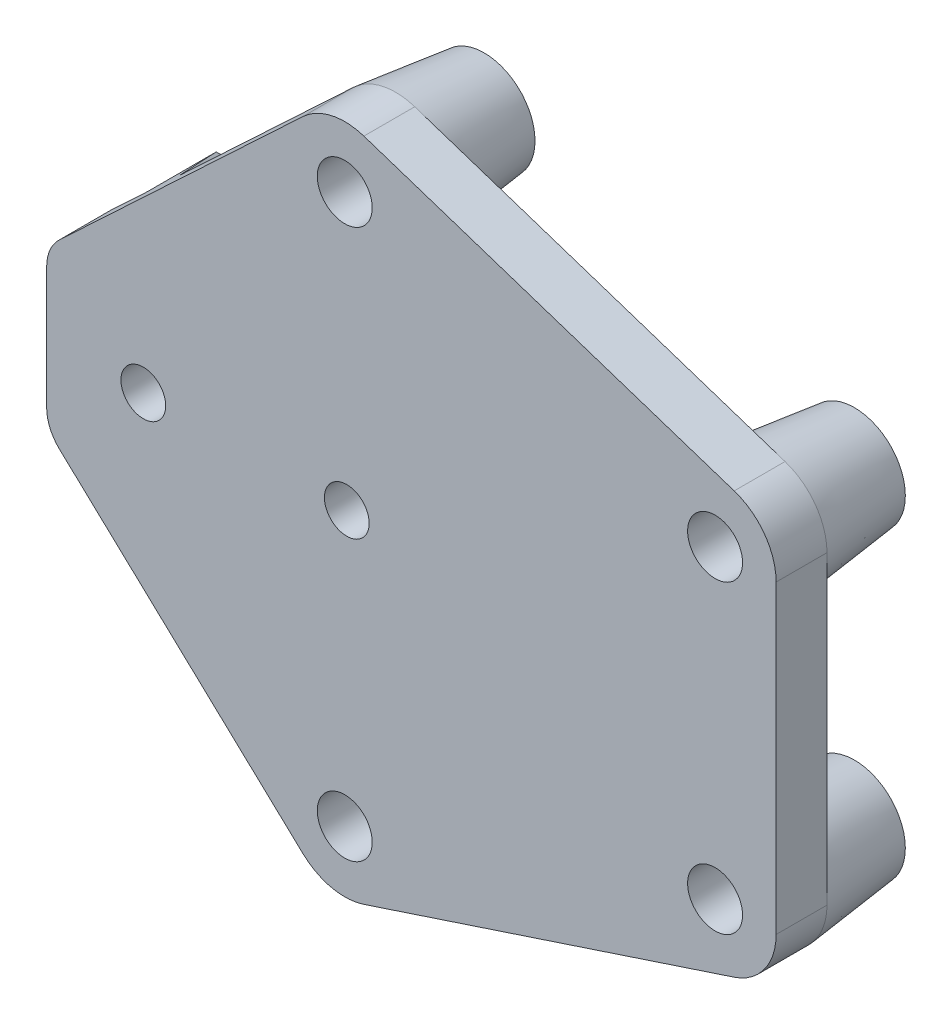
ISO-10303-21;
HEADER;
FILE_DESCRIPTION(('STEP AP214'),'2;1');
FILE_NAME('part.step','',(''),(''),'','','');
FILE_SCHEMA(('AUTOMOTIVE_DESIGN { 1 0 10303 214 1 1 1 1 }'));
ENDSEC;
DATA;
#1=APPLICATION_CONTEXT('core data for automotive mechanical design processes');
#2=APPLICATION_PROTOCOL_DEFINITION('international standard','automotive_design',2000,#1);
#3=PRODUCT_CONTEXT('',#1,'mechanical');
#4=PRODUCT('Part','Part','',(#3));
#5=PRODUCT_RELATED_PRODUCT_CATEGORY('part','',(#4));
#6=PRODUCT_DEFINITION_FORMATION('','',#4);
#7=PRODUCT_DEFINITION_CONTEXT('part definition',#1,'design');
#8=PRODUCT_DEFINITION('design','',#6,#7);
#9=PRODUCT_DEFINITION_SHAPE('','',#8);
#10=(LENGTH_UNIT() NAMED_UNIT(*) SI_UNIT(.MILLI.,.METRE.));
#11=(NAMED_UNIT(*) PLANE_ANGLE_UNIT() SI_UNIT($,.RADIAN.));
#12=(NAMED_UNIT(*) SI_UNIT($,.STERADIAN.) SOLID_ANGLE_UNIT());
#13=UNCERTAINTY_MEASURE_WITH_UNIT(LENGTH_MEASURE(1.E-05),#10,'distance_accuracy_value','');
#14=(GEOMETRIC_REPRESENTATION_CONTEXT(3) GLOBAL_UNCERTAINTY_ASSIGNED_CONTEXT((#13)) GLOBAL_UNIT_ASSIGNED_CONTEXT((#10,
#11,#12)) REPRESENTATION_CONTEXT('',''));
#15=CARTESIAN_POINT('',(0.,0.,0.));
#16=DIRECTION('',(0.,0.,1.));
#17=DIRECTION('',(1.,0.,0.));
#18=AXIS2_PLACEMENT_3D('',#15,#16,#17);
#19=CARTESIAN_POINT('',(0.,0.,0.));
#20=DIRECTION('',(0.,0.,1.));
#21=DIRECTION('',(1.,0.,0.));
#22=AXIS2_PLACEMENT_3D('',#19,#20,#21);
#23=PLANE('',#22);
#24=CARTESIAN_POINT('',(-38.,0.,0.));
#25=DIRECTION('',(0.,0.,1.));
#26=DIRECTION('',(1.,0.,0.));
#27=AXIS2_PLACEMENT_3D('',#24,#25,#26);
#28=CIRCLE('',#27,2.2);
#29=CARTESIAN_POINT('',(-35.8,0.,0.));
#30=VERTEX_POINT('',#29);
#31=EDGE_CURVE('E271',#30,#30,#28,.T.);
#32=ORIENTED_EDGE('',*,*,#31,.T.);
#33=EDGE_LOOP('',(#32));
#34=FACE_BOUND('',#33,.T.);
#35=CARTESIAN_POINT('',(-18.,0.,0.));
#36=DIRECTION('',(0.,0.,1.));
#37=DIRECTION('',(1.,0.,0.));
#38=AXIS2_PLACEMENT_3D('',#35,#36,#37);
#39=CIRCLE('',#38,2.2);
#40=CARTESIAN_POINT('',(-15.8,0.,0.));
#41=VERTEX_POINT('',#40);
#42=EDGE_CURVE('E345',#41,#41,#39,.T.);
#43=ORIENTED_EDGE('',*,*,#42,.T.);
#44=EDGE_LOOP('',(#43));
#45=FACE_BOUND('',#44,.T.);
#46=DIRECTION('',(-0.729191786496374,0.684309388000945,0.));
#47=VECTOR('',#46,1.);
#48=CARTESIAN_POINT('',(-26.1013454879406,-27.8132772690884,0.));
#49=LINE('',#48,#47);
#50=CARTESIAN_POINT('',(-22.3058563280057,-31.3751507189783,0.));
#51=VERTEX_POINT('',#50);
#52=CARTESIAN_POINT('',(-39.435342020454,-15.3,0.));
#53=VERTEX_POINT('',#52);
#54=EDGE_CURVE('E320',#51,#53,#49,.T.);
#55=ORIENTED_EDGE('',*,*,#54,.T.);
#56=DIRECTION('',(1.,0.,0.));
#57=VECTOR('',#56,1.);
#58=CARTESIAN_POINT('',(-13.,-15.3,0.));
#59=LINE('',#58,#57);
#60=CARTESIAN_POINT('',(-13.,-15.3,0.));
#61=VERTEX_POINT('',#60);
#62=EDGE_CURVE('E184',#53,#61,#59,.T.);
#63=ORIENTED_EDGE('',*,*,#62,.T.);
#64=DIRECTION('',(0.,1.,0.));
#65=VECTOR('',#64,1.);
#66=CARTESIAN_POINT('',(-13.,0.,0.));
#67=LINE('',#66,#65);
#68=CARTESIAN_POINT('',(-13.,-10.3,0.));
#69=VERTEX_POINT('',#68);
#70=EDGE_CURVE('E53',#61,#69,#67,.T.);
#71=ORIENTED_EDGE('',*,*,#70,.T.);
#72=DIRECTION('',(1.,0.,0.));
#73=VECTOR('',#72,1.);
#74=CARTESIAN_POINT('',(0.,-10.3,0.));
#75=LINE('',#74,#73);
#76=CARTESIAN_POINT('',(-42.6321056449889,-10.3,0.));
#77=VERTEX_POINT('',#76);
#78=EDGE_CURVE('E210',#77,#69,#75,.T.);
#79=ORIENTED_EDGE('',*,*,#78,.F.);
#80=DIRECTION('',(0.,1.,0.));
#81=VECTOR('',#80,1.);
#82=CARTESIAN_POINT('',(-42.6321056449889,-1.47909828985371E-13,0.));
#83=LINE('',#82,#81);
#84=CARTESIAN_POINT('',(-42.6321056449889,-12.3,0.));
#85=VERTEX_POINT('',#84);
#86=EDGE_CURVE('E213',#85,#77,#83,.T.);
#87=ORIENTED_EDGE('',*,*,#86,.F.);
#88=CARTESIAN_POINT('',(-46.2372375520038,-8.91676714598549,0.));
#89=VERTEX_POINT('',#88);
#90=EDGE_CURVE('E192',#85,#89,#49,.T.);
#91=ORIENTED_EDGE('',*,*,#90,.T.);
#92=CARTESIAN_POINT('',(-43.5,-6.,0.));
#93=DIRECTION('',(0.,0.,1.));
#94=DIRECTION('',(1.,0.,0.));
#95=AXIS2_PLACEMENT_3D('',#92,#93,#94);
#96=CIRCLE('',#95,4.);
#97=CARTESIAN_POINT('',(-47.5,-6.,0.));
#98=VERTEX_POINT('',#97);
#99=EDGE_CURVE('E267',#98,#89,#96,.T.);
#100=ORIENTED_EDGE('',*,*,#99,.F.);
#101=DIRECTION('',(0.,-1.,0.));
#102=VECTOR('',#101,1.);
#103=CARTESIAN_POINT('',(-47.5,0.,0.));
#104=LINE('',#103,#102);
#105=CARTESIAN_POINT('',(-47.5,6.,0.));
#106=VERTEX_POINT('',#105);
#107=EDGE_CURVE('E343',#106,#98,#104,.T.);
#108=ORIENTED_EDGE('',*,*,#107,.F.);
#109=CARTESIAN_POINT('',(-43.5,6.,0.));
#110=DIRECTION('',(0.,0.,1.));
#111=DIRECTION('',(1.,0.,0.));
#112=AXIS2_PLACEMENT_3D('',#109,#110,#111);
#113=CIRCLE('',#112,4.);
#114=CARTESIAN_POINT('',(-46.2372375520038,8.91676714598549,0.));
#115=VERTEX_POINT('',#114);
#116=EDGE_CURVE('E340',#106,#115,#113,.F.);
#117=ORIENTED_EDGE('',*,*,#116,.T.);
#118=DIRECTION('',(-0.729191786496373,-0.684309388000945,0.));
#119=VECTOR('',#118,1.);
#120=CARTESIAN_POINT('',(-26.1013454879406,27.8132772690883,0.));
#121=LINE('',#120,#119);
#122=CARTESIAN_POINT('',(-42.6321056449889,12.3,0.));
#123=VERTEX_POINT('',#122);
#124=EDGE_CURVE('E335',#123,#115,#121,.T.);
#125=ORIENTED_EDGE('',*,*,#124,.F.);
#126=DIRECTION('',(0.,-1.,0.));
#127=VECTOR('',#126,1.);
#128=CARTESIAN_POINT('',(-42.6321056449888,-1.47909828985371E-13,0.));
#129=LINE('',#128,#127);
#130=CARTESIAN_POINT('',(-42.6321056449888,10.3,0.));
#131=VERTEX_POINT('',#130);
#132=EDGE_CURVE('E218',#123,#131,#129,.T.);
#133=ORIENTED_EDGE('',*,*,#132,.T.);
#134=DIRECTION('',(1.,0.,0.));
#135=VECTOR('',#134,1.);
#136=CARTESIAN_POINT('',(0.,10.3,0.));
#137=LINE('',#136,#135);
#138=CARTESIAN_POINT('',(-13.,10.3,0.));
#139=VERTEX_POINT('',#138);
#140=EDGE_CURVE('E235',#131,#139,#137,.T.);
#141=ORIENTED_EDGE('',*,*,#140,.T.);
#142=DIRECTION('',(0.,-1.,0.));
#143=VECTOR('',#142,1.);
#144=CARTESIAN_POINT('',(-13.,0.,0.));
#145=LINE('',#144,#143);
#146=CARTESIAN_POINT('',(-13.,15.3,0.));
#147=VERTEX_POINT('',#146);
#148=EDGE_CURVE('E224',#147,#139,#145,.T.);
#149=ORIENTED_EDGE('',*,*,#148,.F.);
#150=DIRECTION('',(-1.,0.,0.));
#151=VECTOR('',#150,1.);
#152=CARTESIAN_POINT('',(-42.6321056449889,15.3,0.));
#153=LINE('',#152,#151);
#154=CARTESIAN_POINT('',(-39.435342020454,15.3,0.));
#155=VERTEX_POINT('',#154);
#156=EDGE_CURVE('E413',#147,#155,#153,.T.);
#157=ORIENTED_EDGE('',*,*,#156,.T.);
#158=CARTESIAN_POINT('',(-22.3058563280057,31.3751507189783,0.));
#159=VERTEX_POINT('',#158);
#160=EDGE_CURVE('E337',#159,#155,#121,.T.);
#161=ORIENTED_EDGE('',*,*,#160,.F.);
#162=CARTESIAN_POINT('',(-18.2,27.,0.));
#163=DIRECTION('',(0.,0.,1.));
#164=DIRECTION('',(1.,0.,0.));
#165=AXIS2_PLACEMENT_3D('',#162,#163,#164);
#166=CIRCLE('',#165,6.);
#167=CARTESIAN_POINT('',(-16.321429442616,32.6983306907314,0.));
#168=VERTEX_POINT('',#167);
#169=EDGE_CURVE('E383',#159,#168,#166,.T.);
#170=ORIENTED_EDGE('',*,*,#169,.T.);
#171=DIRECTION('',(0.949721781788549,-0.313095092897324,0.));
#172=VECTOR('',#171,1.);
#173=CARTESIAN_POINT('',(8.12298837679362,24.6397314096073,0.));
#174=LINE('',#173,#172);
#175=CARTESIAN_POINT('',(20.0785705573839,20.6983306907313,0.));
#176=VERTEX_POINT('',#175);
#177=EDGE_CURVE('E336',#168,#176,#174,.T.);
#178=ORIENTED_EDGE('',*,*,#177,.T.);
#179=CARTESIAN_POINT('',(18.2,15.,0.));
#180=DIRECTION('',(0.,0.,1.));
#181=DIRECTION('',(1.,0.,0.));
#182=AXIS2_PLACEMENT_3D('',#179,#180,#181);
#183=CIRCLE('',#182,6.);
#184=CARTESIAN_POINT('',(24.2000000000001,15.,0.));
#185=VERTEX_POINT('',#184);
#186=EDGE_CURVE('E378',#176,#185,#183,.T.);
#187=ORIENTED_EDGE('',*,*,#186,.T.);
#188=DIRECTION('',(0.,-1.,0.));
#189=VECTOR('',#188,1.);
#190=CARTESIAN_POINT('',(24.2000000000001,0.,0.));
#191=LINE('',#190,#189);
#192=CARTESIAN_POINT('',(24.2000000000001,-15.,0.));
#193=VERTEX_POINT('',#192);
#194=EDGE_CURVE('E331',#185,#193,#191,.T.);
#195=ORIENTED_EDGE('',*,*,#194,.T.);
#196=CARTESIAN_POINT('',(18.2,-15.,0.));
#197=DIRECTION('',(0.,0.,1.));
#198=DIRECTION('',(1.,0.,0.));
#199=AXIS2_PLACEMENT_3D('',#196,#197,#198);
#200=CIRCLE('',#199,6.);
#201=CARTESIAN_POINT('',(20.0785705573839,-20.6983306907313,0.));
#202=VERTEX_POINT('',#201);
#203=EDGE_CURVE('E407',#193,#202,#200,.T.);
#204=ORIENTED_EDGE('',*,*,#203,.T.);
#205=DIRECTION('',(-0.949721781788549,-0.313095092897324,0.));
#206=VECTOR('',#205,1.);
#207=CARTESIAN_POINT('',(8.12298837679361,-24.6397314096073,0.));
#208=LINE('',#207,#206);
#209=CARTESIAN_POINT('',(-16.3214294426161,-32.6983306907313,0.));
#210=VERTEX_POINT('',#209);
#211=EDGE_CURVE('E325',#202,#210,#208,.T.);
#212=ORIENTED_EDGE('',*,*,#211,.T.);
#213=CARTESIAN_POINT('',(-18.2,-27.,0.));
#214=DIRECTION('',(0.,0.,1.));
#215=DIRECTION('',(1.,0.,0.));
#216=AXIS2_PLACEMENT_3D('',#213,#214,#215);
#217=CIRCLE('',#216,6.);
#218=EDGE_CURVE('E410',#210,#51,#217,.T.);
#219=ORIENTED_EDGE('',*,*,#218,.T.);
#220=EDGE_LOOP('',(#55,#63,#71,#79,#87,#91,#100,#108,#117,#125,#133,#141,#149,#157,#161,#170,
#178,#187,#195,#204,#212,#219));
#221=FACE_BOUND('',#220,.T.);
#222=ADVANCED_FACE('F37',(#34,#45,#221),#23,.F.);
#223=CARTESIAN_POINT('',(-43.5,-6.,5.));
#224=DIRECTION('',(0.,0.,-1.));
#225=DIRECTION('',(-1.,0.,0.));
#226=AXIS2_PLACEMENT_3D('',#223,#224,#225);
#227=CYLINDRICAL_SURFACE('',#226,4.);
#228=ORIENTED_EDGE('',*,*,#99,.T.);
#229=DIRECTION('',(0.,0.,-1.));
#230=VECTOR('',#229,1.);
#231=CARTESIAN_POINT('',(-46.2372375520038,-8.91676714598549,5.));
#232=LINE('',#231,#230);
#233=CARTESIAN_POINT('',(-46.2372375520038,-8.91676714598549,5.));
#234=VERTEX_POINT('',#233);
#235=EDGE_CURVE('E376',#234,#89,#232,.T.);
#236=ORIENTED_EDGE('',*,*,#235,.F.);
#237=CARTESIAN_POINT('',(-43.5,-6.,5.));
#238=DIRECTION('',(0.,0.,1.));
#239=DIRECTION('',(1.,0.,0.));
#240=AXIS2_PLACEMENT_3D('',#237,#238,#239);
#241=CIRCLE('',#240,4.);
#242=CARTESIAN_POINT('',(-47.5,-6.,5.));
#243=VERTEX_POINT('',#242);
#244=EDGE_CURVE('E268',#243,#234,#241,.T.);
#245=ORIENTED_EDGE('',*,*,#244,.F.);
#246=DIRECTION('',(0.,0.,-1.));
#247=VECTOR('',#246,1.);
#248=CARTESIAN_POINT('',(-47.5,-6.,5.));
#249=LINE('',#248,#247);
#250=EDGE_CURVE('E317',#243,#98,#249,.T.);
#251=ORIENTED_EDGE('',*,*,#250,.T.);
#252=EDGE_LOOP('',(#228,#236,#245,#251));
#253=FACE_BOUND('',#252,.T.);
#254=ADVANCED_FACE('F444',(#253),#227,.T.);
#255=CARTESIAN_POINT('',(-26.1013454879406,-27.8132772690884,5.));
#256=DIRECTION('',(-0.684309388000945,-0.729191786496373,0.));
#257=DIRECTION('',(0.729191786496373,-0.684309388000945,0.));
#258=AXIS2_PLACEMENT_3D('',#255,#256,#257);
#259=PLANE('',#258);
#260=ORIENTED_EDGE('',*,*,#54,.F.);
#261=DIRECTION('',(0.,0.,-1.));
#262=VECTOR('',#261,1.);
#263=CARTESIAN_POINT('',(-22.3058563280057,-31.3751507189783,5.));
#264=LINE('',#263,#262);
#265=CARTESIAN_POINT('',(-22.3058563280057,-31.3751507189783,5.));
#266=VERTEX_POINT('',#265);
#267=EDGE_CURVE('E373',#266,#51,#264,.T.);
#268=ORIENTED_EDGE('',*,*,#267,.F.);
#269=DIRECTION('',(-0.729191786496374,0.684309388000945,0.));
#270=VECTOR('',#269,1.);
#271=CARTESIAN_POINT('',(-26.1013454879406,-27.8132772690884,5.));
#272=LINE('',#271,#270);
#273=EDGE_CURVE('E270',#266,#234,#272,.T.);
#274=ORIENTED_EDGE('',*,*,#273,.T.);
#275=ORIENTED_EDGE('',*,*,#235,.T.);
#276=ORIENTED_EDGE('',*,*,#90,.F.);
#277=DIRECTION('',(0.,0.,-1.));
#278=VECTOR('',#277,1.);
#279=CARTESIAN_POINT('',(-42.6321056449889,-12.3,-6.8));
#280=LINE('',#279,#278);
#281=CARTESIAN_POINT('',(-42.6321056449889,-12.3,-6.79999999999995));
#282=VERTEX_POINT('',#281);
#283=EDGE_CURVE('E11',#85,#282,#280,.T.);
#284=ORIENTED_EDGE('',*,*,#283,.T.);
#285=DIRECTION('',(-0.395116216152556,0.370796464073926,-0.840471985234226));
#286=VECTOR('',#285,1.);
#287=CARTESIAN_POINT('',(-35.9765166998902,-18.5459315671803,7.35744488560872));
#288=LINE('',#287,#286);
#289=EDGE_CURVE('E181',#282,#53,#288,.F.);
#290=ORIENTED_EDGE('',*,*,#289,.T.);
#291=EDGE_LOOP('',(#260,#268,#274,#275,#276,#284,#290));
#292=FACE_BOUND('',#291,.T.);
#293=ADVANCED_FACE('F190',(#292),#259,.T.);
#294=CARTESIAN_POINT('',(-18.2,-27.,5.));
#295=DIRECTION('',(0.,0.,-1.));
#296=DIRECTION('',(-1.,0.,0.));
#297=AXIS2_PLACEMENT_3D('',#294,#295,#296);
#298=CYLINDRICAL_SURFACE('',#297,6.);
#299=CARTESIAN_POINT('',(-18.2,-27.,0.));
#300=DIRECTION('',(0.,0.,1.));
#301=DIRECTION('',(1.,0.,0.));
#302=AXIS2_PLACEMENT_3D('',#299,#300,#301);
#303=CIRCLE('',#302,6.);
#304=EDGE_CURVE('E322',#51,#210,#303,.T.);
#305=ORIENTED_EDGE('',*,*,#304,.T.);
#306=DIRECTION('',(0.,0.,-1.));
#307=VECTOR('',#306,1.);
#308=CARTESIAN_POINT('',(-16.321429442616,-32.6983306907313,5.));
#309=LINE('',#308,#307);
#310=CARTESIAN_POINT('',(-16.321429442616,-32.6983306907313,5.));
#311=VERTEX_POINT('',#310);
#312=EDGE_CURVE('E370',#311,#210,#309,.T.);
#313=ORIENTED_EDGE('',*,*,#312,.F.);
#314=CARTESIAN_POINT('',(-18.2,-27.,5.));
#315=DIRECTION('',(0.,0.,1.));
#316=DIRECTION('',(1.,0.,0.));
#317=AXIS2_PLACEMENT_3D('',#314,#315,#316);
#318=CIRCLE('',#317,6.);
#319=EDGE_CURVE('E274',#266,#311,#318,.T.);
#320=ORIENTED_EDGE('',*,*,#319,.F.);
#321=ORIENTED_EDGE('',*,*,#267,.T.);
#322=EDGE_LOOP('',(#305,#313,#320,#321));
#323=FACE_BOUND('',#322,.T.);
#324=ADVANCED_FACE('F433',(#323),#298,.T.);
#325=CARTESIAN_POINT('',(8.12298837679361,-24.6397314096073,5.));
#326=DIRECTION('',(0.313095092897324,-0.949721781788549,0.));
#327=DIRECTION('',(0.949721781788549,0.313095092897324,0.));
#328=AXIS2_PLACEMENT_3D('',#325,#326,#327);
#329=PLANE('',#328);
#330=ORIENTED_EDGE('',*,*,#211,.F.);
#331=DIRECTION('',(0.,0.,-1.));
#332=VECTOR('',#331,1.);
#333=CARTESIAN_POINT('',(20.078570557384,-20.6983306907313,5.));
#334=LINE('',#333,#332);
#335=CARTESIAN_POINT('',(20.078570557384,-20.6983306907313,5.));
#336=VERTEX_POINT('',#335);
#337=EDGE_CURVE('E366',#336,#202,#334,.T.);
#338=ORIENTED_EDGE('',*,*,#337,.F.);
#339=DIRECTION('',(-0.949721781788549,-0.313095092897324,0.));
#340=VECTOR('',#339,1.);
#341=CARTESIAN_POINT('',(8.12298837679361,-24.6397314096073,5.));
#342=LINE('',#341,#340);
#343=EDGE_CURVE('E276',#336,#311,#342,.T.);
#344=ORIENTED_EDGE('',*,*,#343,.T.);
#345=ORIENTED_EDGE('',*,*,#312,.T.);
#346=EDGE_LOOP('',(#330,#338,#344,#345));
#347=FACE_BOUND('',#346,.T.);
#348=ADVANCED_FACE('F546',(#347),#329,.T.);
#349=CARTESIAN_POINT('',(18.2,-15.,5.));
#350=DIRECTION('',(0.,0.,-1.));
#351=DIRECTION('',(-1.,0.,0.));
#352=AXIS2_PLACEMENT_3D('',#349,#350,#351);
#353=CYLINDRICAL_SURFACE('',#352,6.00000000000006);
#354=CARTESIAN_POINT('',(18.2,-15.,0.));
#355=DIRECTION('',(0.,0.,1.));
#356=DIRECTION('',(1.,0.,0.));
#357=AXIS2_PLACEMENT_3D('',#354,#355,#356);
#358=CIRCLE('',#357,6.00000000000006);
#359=EDGE_CURVE('E328',#193,#202,#358,.F.);
#360=ORIENTED_EDGE('',*,*,#359,.F.);
#361=DIRECTION('',(0.,0.,-1.));
#362=VECTOR('',#361,1.);
#363=CARTESIAN_POINT('',(24.2000000000001,-15.,5.));
#364=LINE('',#363,#362);
#365=CARTESIAN_POINT('',(24.2000000000001,-15.,5.));
#366=VERTEX_POINT('',#365);
#367=EDGE_CURVE('E364',#366,#193,#364,.T.);
#368=ORIENTED_EDGE('',*,*,#367,.F.);
#369=CARTESIAN_POINT('',(18.2,-15.,5.));
#370=DIRECTION('',(0.,0.,1.));
#371=DIRECTION('',(1.,0.,0.));
#372=AXIS2_PLACEMENT_3D('',#369,#370,#371);
#373=CIRCLE('',#372,6.00000000000006);
#374=EDGE_CURVE('E279',#366,#336,#373,.F.);
#375=ORIENTED_EDGE('',*,*,#374,.T.);
#376=ORIENTED_EDGE('',*,*,#337,.T.);
#377=EDGE_LOOP('',(#360,#368,#375,#376));
#378=FACE_BOUND('',#377,.T.);
#379=ADVANCED_FACE('F542',(#378),#353,.T.);
#380=CARTESIAN_POINT('',(24.2000000000001,0.,5.));
#381=DIRECTION('',(1.,0.,0.));
#382=DIRECTION('',(0.,0.,-1.));
#383=AXIS2_PLACEMENT_3D('',#380,#381,#382);
#384=PLANE('',#383);
#385=ORIENTED_EDGE('',*,*,#194,.F.);
#386=DIRECTION('',(0.,0.,-1.));
#387=VECTOR('',#386,1.);
#388=CARTESIAN_POINT('',(24.2000000000001,15.,5.));
#389=LINE('',#388,#387);
#390=CARTESIAN_POINT('',(24.2000000000001,15.,5.));
#391=VERTEX_POINT('',#390);
#392=EDGE_CURVE('E367',#391,#185,#389,.T.);
#393=ORIENTED_EDGE('',*,*,#392,.F.);
#394=DIRECTION('',(0.,-1.,0.));
#395=VECTOR('',#394,1.);
#396=CARTESIAN_POINT('',(24.2000000000001,0.,5.));
#397=LINE('',#396,#395);
#398=EDGE_CURVE('E282',#391,#366,#397,.T.);
#399=ORIENTED_EDGE('',*,*,#398,.T.);
#400=ORIENTED_EDGE('',*,*,#367,.T.);
#401=EDGE_LOOP('',(#385,#393,#399,#400));
#402=FACE_BOUND('',#401,.T.);
#403=ADVANCED_FACE('F538',(#402),#384,.T.);
#404=CARTESIAN_POINT('',(18.2,15.,5.));
#405=DIRECTION('',(0.,0.,-1.));
#406=DIRECTION('',(-1.,0.,0.));
#407=AXIS2_PLACEMENT_3D('',#404,#405,#406);
#408=CYLINDRICAL_SURFACE('',#407,6.00000000000006);
#409=CARTESIAN_POINT('',(18.2,15.,0.));
#410=DIRECTION('',(0.,0.,1.));
#411=DIRECTION('',(1.,0.,0.));
#412=AXIS2_PLACEMENT_3D('',#409,#410,#411);
#413=CIRCLE('',#412,6.00000000000006);
#414=EDGE_CURVE('E388',#185,#176,#413,.T.);
#415=ORIENTED_EDGE('',*,*,#414,.T.);
#416=DIRECTION('',(0.,0.,-1.));
#417=VECTOR('',#416,1.);
#418=CARTESIAN_POINT('',(20.078570557384,20.6983306907313,5.));
#419=LINE('',#418,#417);
#420=CARTESIAN_POINT('',(20.078570557384,20.6983306907313,5.));
#421=VERTEX_POINT('',#420);
#422=EDGE_CURVE('E363',#421,#176,#419,.T.);
#423=ORIENTED_EDGE('',*,*,#422,.F.);
#424=CARTESIAN_POINT('',(18.2,15.,5.));
#425=DIRECTION('',(0.,0.,1.));
#426=DIRECTION('',(1.,0.,0.));
#427=AXIS2_PLACEMENT_3D('',#424,#425,#426);
#428=CIRCLE('',#427,6.00000000000006);
#429=EDGE_CURVE('E285',#391,#421,#428,.T.);
#430=ORIENTED_EDGE('',*,*,#429,.F.);
#431=ORIENTED_EDGE('',*,*,#392,.T.);
#432=EDGE_LOOP('',(#415,#423,#430,#431));
#433=FACE_BOUND('',#432,.T.);
#434=ADVANCED_FACE('F534',(#433),#408,.T.);
#435=CARTESIAN_POINT('',(8.12298837679362,24.6397314096073,5.));
#436=DIRECTION('',(0.313095092897324,0.949721781788549,0.));
#437=DIRECTION('',(-0.949721781788549,0.313095092897324,0.));
#438=AXIS2_PLACEMENT_3D('',#435,#436,#437);
#439=PLANE('',#438);
#440=ORIENTED_EDGE('',*,*,#177,.F.);
#441=DIRECTION('',(0.,0.,-1.));
#442=VECTOR('',#441,1.);
#443=CARTESIAN_POINT('',(-16.321429442616,32.6983306907314,5.));
#444=LINE('',#443,#442);
#445=CARTESIAN_POINT('',(-16.321429442616,32.6983306907314,5.));
#446=VERTEX_POINT('',#445);
#447=EDGE_CURVE('E360',#446,#168,#444,.T.);
#448=ORIENTED_EDGE('',*,*,#447,.F.);
#449=DIRECTION('',(0.949721781788549,-0.313095092897324,0.));
#450=VECTOR('',#449,1.);
#451=CARTESIAN_POINT('',(8.12298837679362,24.6397314096073,5.));
#452=LINE('',#451,#450);
#453=EDGE_CURVE('E287',#446,#421,#452,.T.);
#454=ORIENTED_EDGE('',*,*,#453,.T.);
#455=ORIENTED_EDGE('',*,*,#422,.T.);
#456=EDGE_LOOP('',(#440,#448,#454,#455));
#457=FACE_BOUND('',#456,.T.);
#458=ADVANCED_FACE('F530',(#457),#439,.T.);
#459=CARTESIAN_POINT('',(-18.2,27.,5.));
#460=DIRECTION('',(0.,0.,-1.));
#461=DIRECTION('',(-1.,0.,0.));
#462=AXIS2_PLACEMENT_3D('',#459,#460,#461);
#463=CYLINDRICAL_SURFACE('',#462,6.00000000000006);
#464=CARTESIAN_POINT('',(-18.2,27.,0.));
#465=DIRECTION('',(0.,0.,1.));
#466=DIRECTION('',(1.,0.,0.));
#467=AXIS2_PLACEMENT_3D('',#464,#465,#466);
#468=CIRCLE('',#467,6.00000000000006);
#469=EDGE_CURVE('E332',#168,#159,#468,.T.);
#470=ORIENTED_EDGE('',*,*,#469,.T.);
#471=DIRECTION('',(0.,0.,-1.));
#472=VECTOR('',#471,1.);
#473=CARTESIAN_POINT('',(-22.3058563280057,31.3751507189783,5.));
#474=LINE('',#473,#472);
#475=CARTESIAN_POINT('',(-22.3058563280057,31.3751507189783,5.));
#476=VERTEX_POINT('',#475);
#477=EDGE_CURVE('E357',#476,#159,#474,.T.);
#478=ORIENTED_EDGE('',*,*,#477,.F.);
#479=CARTESIAN_POINT('',(-18.2,27.,5.));
#480=DIRECTION('',(0.,0.,1.));
#481=DIRECTION('',(1.,0.,0.));
#482=AXIS2_PLACEMENT_3D('',#479,#480,#481);
#483=CIRCLE('',#482,6.00000000000006);
#484=EDGE_CURVE('E290',#446,#476,#483,.T.);
#485=ORIENTED_EDGE('',*,*,#484,.F.);
#486=ORIENTED_EDGE('',*,*,#447,.T.);
#487=EDGE_LOOP('',(#470,#478,#485,#486));
#488=FACE_BOUND('',#487,.T.);
#489=ADVANCED_FACE('F527',(#488),#463,.T.);
#490=CARTESIAN_POINT('',(-26.1013454879406,27.8132772690883,5.));
#491=DIRECTION('',(0.684309388000945,-0.729191786496373,0.));
#492=DIRECTION('',(0.729191786496373,0.684309388000945,0.));
#493=AXIS2_PLACEMENT_3D('',#490,#491,#492);
#494=PLANE('',#493);
#495=ORIENTED_EDGE('',*,*,#160,.T.);
#496=DIRECTION('',(0.395116216152556,0.370796464073926,0.840471985234226));
#497=VECTOR('',#496,1.);
#498=CARTESIAN_POINT('',(-33.8599688538781,20.5322040238936,11.8596624541588));
#499=LINE('',#498,#497);
#500=CARTESIAN_POINT('',(-42.6321056449889,12.3,-6.8));
#501=VERTEX_POINT('',#500);
#502=EDGE_CURVE('E418',#155,#501,#499,.F.);
#503=ORIENTED_EDGE('',*,*,#502,.T.);
#504=DIRECTION('',(0.,0.,-1.));
#505=VECTOR('',#504,1.);
#506=CARTESIAN_POINT('',(-42.6321056449889,12.3,5.));
#507=LINE('',#506,#505);
#508=EDGE_CURVE('E421',#123,#501,#507,.T.);
#509=ORIENTED_EDGE('',*,*,#508,.F.);
#510=ORIENTED_EDGE('',*,*,#124,.T.);
#511=DIRECTION('',(0.,0.,-1.));
#512=VECTOR('',#511,1.);
#513=CARTESIAN_POINT('',(-46.2372375520038,8.91676714598549,5.));
#514=LINE('',#513,#512);
#515=CARTESIAN_POINT('',(-46.2372375520038,8.91676714598549,5.));
#516=VERTEX_POINT('',#515);
#517=EDGE_CURVE('E354',#516,#115,#514,.T.);
#518=ORIENTED_EDGE('',*,*,#517,.F.);
#519=DIRECTION('',(-0.729191786496373,-0.684309388000945,0.));
#520=VECTOR('',#519,1.);
#521=CARTESIAN_POINT('',(-26.1013454879406,27.8132772690883,5.));
#522=LINE('',#521,#520);
#523=EDGE_CURVE('E292',#476,#516,#522,.T.);
#524=ORIENTED_EDGE('',*,*,#523,.F.);
#525=ORIENTED_EDGE('',*,*,#477,.T.);
#526=EDGE_LOOP('',(#495,#503,#509,#510,#518,#524,#525));
#527=FACE_BOUND('',#526,.T.);
#528=ADVANCED_FACE('F455',(#527),#494,.F.);
#529=CARTESIAN_POINT('',(-43.5,6.,5.));
#530=DIRECTION('',(0.,0.,-1.));
#531=DIRECTION('',(-1.,0.,0.));
#532=AXIS2_PLACEMENT_3D('',#529,#530,#531);
#533=CYLINDRICAL_SURFACE('',#532,4.);
#534=ORIENTED_EDGE('',*,*,#116,.F.);
#535=DIRECTION('',(0.,0.,-1.));
#536=VECTOR('',#535,1.);
#537=CARTESIAN_POINT('',(-47.5,6.,5.));
#538=LINE('',#537,#536);
#539=CARTESIAN_POINT('',(-47.5,6.,5.));
#540=VERTEX_POINT('',#539);
#541=EDGE_CURVE('E352',#540,#106,#538,.T.);
#542=ORIENTED_EDGE('',*,*,#541,.F.);
#543=CARTESIAN_POINT('',(-43.5,6.,5.));
#544=DIRECTION('',(0.,0.,1.));
#545=DIRECTION('',(1.,0.,0.));
#546=AXIS2_PLACEMENT_3D('',#543,#544,#545);
#547=CIRCLE('',#546,4.);
#548=EDGE_CURVE('E294',#540,#516,#547,.F.);
#549=ORIENTED_EDGE('',*,*,#548,.T.);
#550=ORIENTED_EDGE('',*,*,#517,.T.);
#551=EDGE_LOOP('',(#534,#542,#549,#550));
#552=FACE_BOUND('',#551,.T.);
#553=ADVANCED_FACE('F451',(#552),#533,.T.);
#554=CARTESIAN_POINT('',(18.2,-15.,5.));
#555=DIRECTION('',(0.,0.,-1.));
#556=DIRECTION('',(-1.,0.,0.));
#557=AXIS2_PLACEMENT_3D('',#554,#555,#556);
#558=CYLINDRICAL_SURFACE('',#557,2.7);
#559=CARTESIAN_POINT('',(18.2,-15.,5.));
#560=DIRECTION('',(0.,0.,1.));
#561=DIRECTION('',(1.,0.,0.));
#562=AXIS2_PLACEMENT_3D('',#559,#560,#561);
#563=CIRCLE('',#562,2.7);
#564=CARTESIAN_POINT('',(20.9,-15.,5.));
#565=VERTEX_POINT('',#564);
#566=EDGE_CURVE('E311',#565,#565,#563,.F.);
#567=ORIENTED_EDGE('',*,*,#566,.F.);
#568=EDGE_LOOP('',(#567));
#569=FACE_BOUND('',#568,.T.);
#570=CARTESIAN_POINT('',(18.2,-15.,-8.7));
#571=DIRECTION('',(0.,0.,-1.));
#572=DIRECTION('',(1.,0.,0.));
#573=AXIS2_PLACEMENT_3D('',#570,#571,#572);
#574=CIRCLE('',#573,2.7);
#575=CARTESIAN_POINT('',(20.9,-15.,-8.7));
#576=VERTEX_POINT('',#575);
#577=EDGE_CURVE('E252',#576,#576,#574,.T.);
#578=ORIENTED_EDGE('',*,*,#577,.T.);
#579=EDGE_LOOP('',(#578));
#580=FACE_BOUND('',#579,.T.);
#581=ADVANCED_FACE('F501',(#569,#580),#558,.F.);
#582=CARTESIAN_POINT('',(18.2,15.,5.));
#583=DIRECTION('',(0.,0.,-1.));
#584=DIRECTION('',(-1.,0.,0.));
#585=AXIS2_PLACEMENT_3D('',#582,#583,#584);
#586=CYLINDRICAL_SURFACE('',#585,2.7);
#587=CARTESIAN_POINT('',(18.2,15.,5.));
#588=DIRECTION('',(0.,0.,1.));
#589=DIRECTION('',(1.,0.,0.));
#590=AXIS2_PLACEMENT_3D('',#587,#588,#589);
#591=CIRCLE('',#590,2.7);
#592=CARTESIAN_POINT('',(20.9,15.,5.));
#593=VERTEX_POINT('',#592);
#594=EDGE_CURVE('E308',#593,#593,#591,.T.);
#595=ORIENTED_EDGE('',*,*,#594,.T.);
#596=EDGE_LOOP('',(#595));
#597=FACE_BOUND('',#596,.T.);
#598=CARTESIAN_POINT('',(18.2,15.,-8.7));
#599=DIRECTION('',(0.,0.,1.));
#600=DIRECTION('',(1.,0.,0.));
#601=AXIS2_PLACEMENT_3D('',#598,#599,#600);
#602=CIRCLE('',#601,2.7);
#603=CARTESIAN_POINT('',(20.9,15.,-8.7));
#604=VERTEX_POINT('',#603);
#605=EDGE_CURVE('E264',#604,#604,#602,.T.);
#606=ORIENTED_EDGE('',*,*,#605,.F.);
#607=EDGE_LOOP('',(#606));
#608=FACE_BOUND('',#607,.T.);
#609=ADVANCED_FACE('F504',(#597,#608),#586,.F.);
#610=CARTESIAN_POINT('',(-38.,0.,5.));
#611=DIRECTION('',(0.,0.,-1.));
#612=DIRECTION('',(-1.,0.,0.));
#613=AXIS2_PLACEMENT_3D('',#610,#611,#612);
#614=CYLINDRICAL_SURFACE('',#613,2.2);
#615=CARTESIAN_POINT('',(-38.,0.,5.));
#616=DIRECTION('',(0.,0.,1.));
#617=DIRECTION('',(1.,0.,0.));
#618=AXIS2_PLACEMENT_3D('',#615,#616,#617);
#619=CIRCLE('',#618,2.2);
#620=CARTESIAN_POINT('',(-35.8,0.,5.));
#621=VERTEX_POINT('',#620);
#622=EDGE_CURVE('E305',#621,#621,#619,.T.);
#623=ORIENTED_EDGE('',*,*,#622,.T.);
#624=EDGE_LOOP('',(#623));
#625=FACE_BOUND('',#624,.T.);
#626=ORIENTED_EDGE('',*,*,#31,.F.);
#627=EDGE_LOOP('',(#626));
#628=FACE_BOUND('',#627,.T.);
#629=ADVANCED_FACE('F508',(#625,#628),#614,.F.);
#630=CARTESIAN_POINT('',(-18.,0.,5.));
#631=DIRECTION('',(0.,0.,-1.));
#632=DIRECTION('',(-1.,0.,0.));
#633=AXIS2_PLACEMENT_3D('',#630,#631,#632);
#634=CYLINDRICAL_SURFACE('',#633,2.2);
#635=CARTESIAN_POINT('',(-18.,0.,5.));
#636=DIRECTION('',(0.,0.,1.));
#637=DIRECTION('',(1.,0.,0.));
#638=AXIS2_PLACEMENT_3D('',#635,#636,#637);
#639=CIRCLE('',#638,2.2);
#640=CARTESIAN_POINT('',(-15.8,0.,5.));
#641=VERTEX_POINT('',#640);
#642=EDGE_CURVE('E302',#641,#641,#639,.T.);
#643=ORIENTED_EDGE('',*,*,#642,.T.);
#644=EDGE_LOOP('',(#643));
#645=FACE_BOUND('',#644,.T.);
#646=ORIENTED_EDGE('',*,*,#42,.F.);
#647=EDGE_LOOP('',(#646));
#648=FACE_BOUND('',#647,.T.);
#649=ADVANCED_FACE('F512',(#645,#648),#634,.F.);
#650=CARTESIAN_POINT('',(-18.2,27.,5.));
#651=DIRECTION('',(0.,0.,-1.));
#652=DIRECTION('',(-1.,0.,0.));
#653=AXIS2_PLACEMENT_3D('',#650,#651,#652);
#654=CYLINDRICAL_SURFACE('',#653,2.7);
#655=CARTESIAN_POINT('',(-18.2,27.,5.));
#656=DIRECTION('',(0.,0.,1.));
#657=DIRECTION('',(1.,0.,0.));
#658=AXIS2_PLACEMENT_3D('',#655,#656,#657);
#659=CIRCLE('',#658,2.7);
#660=CARTESIAN_POINT('',(-15.5,27.,5.));
#661=VERTEX_POINT('',#660);
#662=EDGE_CURVE('E299',#661,#661,#659,.T.);
#663=ORIENTED_EDGE('',*,*,#662,.T.);
#664=EDGE_LOOP('',(#663));
#665=FACE_BOUND('',#664,.T.);
#666=CARTESIAN_POINT('',(-18.2,27.,-8.7));
#667=DIRECTION('',(0.,0.,1.));
#668=DIRECTION('',(1.,0.,0.));
#669=AXIS2_PLACEMENT_3D('',#666,#667,#668);
#670=CIRCLE('',#669,2.7);
#671=CARTESIAN_POINT('',(-15.5,27.,-8.7));
#672=VERTEX_POINT('',#671);
#673=EDGE_CURVE('E258',#672,#672,#670,.T.);
#674=ORIENTED_EDGE('',*,*,#673,.F.);
#675=EDGE_LOOP('',(#674));
#676=FACE_BOUND('',#675,.T.);
#677=ADVANCED_FACE('F516',(#665,#676),#654,.F.);
#678=CARTESIAN_POINT('',(-47.5,0.,5.));
#679=DIRECTION('',(1.,0.,0.));
#680=DIRECTION('',(0.,1.,0.));
#681=AXIS2_PLACEMENT_3D('',#678,#679,#680);
#682=PLANE('',#681);
#683=ORIENTED_EDGE('',*,*,#107,.T.);
#684=ORIENTED_EDGE('',*,*,#250,.F.);
#685=DIRECTION('',(0.,-1.,0.));
#686=VECTOR('',#685,1.);
#687=CARTESIAN_POINT('',(-47.5,0.,5.));
#688=LINE('',#687,#686);
#689=EDGE_CURVE('E297',#540,#243,#688,.T.);
#690=ORIENTED_EDGE('',*,*,#689,.F.);
#691=ORIENTED_EDGE('',*,*,#541,.T.);
#692=EDGE_LOOP('',(#683,#684,#690,#691));
#693=FACE_BOUND('',#692,.T.);
#694=ADVANCED_FACE('F499',(#693),#682,.F.);
#695=CARTESIAN_POINT('',(-18.2,-27.,5.));
#696=DIRECTION('',(0.,0.,-1.));
#697=DIRECTION('',(-1.,0.,0.));
#698=AXIS2_PLACEMENT_3D('',#695,#696,#697);
#699=CYLINDRICAL_SURFACE('',#698,2.7);
#700=CARTESIAN_POINT('',(-18.2,-27.,5.));
#701=DIRECTION('',(0.,0.,1.));
#702=DIRECTION('',(1.,0.,0.));
#703=AXIS2_PLACEMENT_3D('',#700,#701,#702);
#704=CIRCLE('',#703,2.7);
#705=CARTESIAN_POINT('',(-15.5,-27.,5.));
#706=VERTEX_POINT('',#705);
#707=EDGE_CURVE('E314',#706,#706,#704,.T.);
#708=ORIENTED_EDGE('',*,*,#707,.T.);
#709=EDGE_LOOP('',(#708));
#710=FACE_BOUND('',#709,.T.);
#711=CARTESIAN_POINT('',(-18.2,-27.,-8.7));
#712=DIRECTION('',(0.,0.,-1.));
#713=DIRECTION('',(1.,0.,0.));
#714=AXIS2_PLACEMENT_3D('',#711,#712,#713);
#715=CIRCLE('',#714,2.7);
#716=CARTESIAN_POINT('',(-15.5,-27.,-8.7));
#717=VERTEX_POINT('',#716);
#718=EDGE_CURVE('E246',#717,#717,#715,.T.);
#719=ORIENTED_EDGE('',*,*,#718,.T.);
#720=EDGE_LOOP('',(#719));
#721=FACE_BOUND('',#720,.T.);
#722=ADVANCED_FACE('F496',(#710,#721),#699,.F.);
#723=CARTESIAN_POINT('',(0.,0.,5.));
#724=DIRECTION('',(0.,0.,1.));
#725=DIRECTION('',(1.,0.,0.));
#726=AXIS2_PLACEMENT_3D('',#723,#724,#725);
#727=PLANE('',#726);
#728=ORIENTED_EDGE('',*,*,#244,.T.);
#729=ORIENTED_EDGE('',*,*,#273,.F.);
#730=ORIENTED_EDGE('',*,*,#319,.T.);
#731=ORIENTED_EDGE('',*,*,#343,.F.);
#732=ORIENTED_EDGE('',*,*,#374,.F.);
#733=ORIENTED_EDGE('',*,*,#398,.F.);
#734=ORIENTED_EDGE('',*,*,#429,.T.);
#735=ORIENTED_EDGE('',*,*,#453,.F.);
#736=ORIENTED_EDGE('',*,*,#484,.T.);
#737=ORIENTED_EDGE('',*,*,#523,.T.);
#738=ORIENTED_EDGE('',*,*,#548,.F.);
#739=ORIENTED_EDGE('',*,*,#689,.T.);
#740=EDGE_LOOP('',(#728,#729,#730,#731,#732,#733,#734,#735,#736,#737,#738,#739));
#741=FACE_BOUND('',#740,.T.);
#742=ORIENTED_EDGE('',*,*,#662,.F.);
#743=EDGE_LOOP('',(#742));
#744=FACE_BOUND('',#743,.T.);
#745=ORIENTED_EDGE('',*,*,#642,.F.);
#746=EDGE_LOOP('',(#745));
#747=FACE_BOUND('',#746,.T.);
#748=ORIENTED_EDGE('',*,*,#622,.F.);
#749=EDGE_LOOP('',(#748));
#750=FACE_BOUND('',#749,.T.);
#751=ORIENTED_EDGE('',*,*,#594,.F.);
#752=EDGE_LOOP('',(#751));
#753=FACE_BOUND('',#752,.T.);
#754=ORIENTED_EDGE('',*,*,#566,.T.);
#755=EDGE_LOOP('',(#754));
#756=FACE_BOUND('',#755,.T.);
#757=ORIENTED_EDGE('',*,*,#707,.F.);
#758=EDGE_LOOP('',(#757));
#759=FACE_BOUND('',#758,.T.);
#760=ADVANCED_FACE('F436',(#741,#744,#747,#750,#753,#756,#759),#727,.T.);
#761=CARTESIAN_POINT('',(6.24441781940966,18.941400718876,-8.7));
#762=DIRECTION('',(0.,0.,-1.));
#763=DIRECTION('',(-1.,0.,0.));
#764=AXIS2_PLACEMENT_3D('',#761,#762,#763);
#765=PLANE('',#764);
#766=ORIENTED_EDGE('',*,*,#605,.T.);
#767=EDGE_LOOP('',(#766));
#768=FACE_BOUND('',#767,.T.);
#769=CARTESIAN_POINT('',(18.2,15.,-8.7));
#770=DIRECTION('',(0.,0.,1.));
#771=DIRECTION('',(1.,0.,0.));
#772=AXIS2_PLACEMENT_3D('',#769,#770,#771);
#773=CIRCLE('',#772,5.);
#774=CARTESIAN_POINT('',(23.2,15.,-8.7));
#775=VERTEX_POINT('',#774);
#776=EDGE_CURVE('E261',#775,#775,#773,.T.);
#777=ORIENTED_EDGE('',*,*,#776,.F.);
#778=EDGE_LOOP('',(#777));
#779=FACE_BOUND('',#778,.T.);
#780=ADVANCED_FACE('F684',(#768,#779),#765,.T.);
#781=CARTESIAN_POINT('',(18.2,15.,0.));
#782=DIRECTION('',(0.,0.,1.));
#783=DIRECTION('',(1.,0.,0.));
#784=AXIS2_PLACEMENT_3D('',#781,#782,#783);
#785=CONICAL_SURFACE('',#784,6.,0.114440305270063);
#786=ORIENTED_EDGE('',*,*,#776,.T.);
#787=EDGE_LOOP('',(#786));
#788=FACE_BOUND('',#787,.T.);
#789=ORIENTED_EDGE('',*,*,#414,.F.);
#790=ORIENTED_EDGE('',*,*,#186,.F.);
#791=EDGE_LOOP('',(#789,#790));
#792=FACE_BOUND('',#791,.T.);
#793=ADVANCED_FACE('F689',(#788,#792),#785,.T.);
#794=CARTESIAN_POINT('',(6.24441781940966,18.941400718876,-8.7));
#795=DIRECTION('',(0.,0.,-1.));
#796=DIRECTION('',(-1.,0.,0.));
#797=AXIS2_PLACEMENT_3D('',#794,#795,#796);
#798=PLANE('',#797);
#799=ORIENTED_EDGE('',*,*,#673,.T.);
#800=EDGE_LOOP('',(#799));
#801=FACE_BOUND('',#800,.T.);
#802=CARTESIAN_POINT('',(-18.2,27.,-8.7));
#803=DIRECTION('',(0.,0.,1.));
#804=DIRECTION('',(1.,0.,0.));
#805=AXIS2_PLACEMENT_3D('',#802,#803,#804);
#806=CIRCLE('',#805,5.);
#807=CARTESIAN_POINT('',(-13.2,27.,-8.7));
#808=VERTEX_POINT('',#807);
#809=EDGE_CURVE('E255',#808,#808,#806,.T.);
#810=ORIENTED_EDGE('',*,*,#809,.F.);
#811=EDGE_LOOP('',(#810));
#812=FACE_BOUND('',#811,.T.);
#813=ADVANCED_FACE('F695',(#801,#812),#798,.T.);
#814=CARTESIAN_POINT('',(-18.2,27.,0.));
#815=DIRECTION('',(0.,0.,1.));
#816=DIRECTION('',(1.,0.,0.));
#817=AXIS2_PLACEMENT_3D('',#814,#815,#816);
#818=CONICAL_SURFACE('',#817,6.,0.114440305270064);
#819=ORIENTED_EDGE('',*,*,#809,.T.);
#820=EDGE_LOOP('',(#819));
#821=FACE_BOUND('',#820,.T.);
#822=ORIENTED_EDGE('',*,*,#469,.F.);
#823=ORIENTED_EDGE('',*,*,#169,.F.);
#824=EDGE_LOOP('',(#822,#823));
#825=FACE_BOUND('',#824,.T.);
#826=ADVANCED_FACE('F702',(#821,#825),#818,.T.);
#827=CARTESIAN_POINT('',(6.24441781940966,-18.941400718876,-8.7));
#828=DIRECTION('',(0.,0.,-1.));
#829=DIRECTION('',(-1.,0.,0.));
#830=AXIS2_PLACEMENT_3D('',#827,#828,#829);
#831=PLANE('',#830);
#832=ORIENTED_EDGE('',*,*,#577,.F.);
#833=EDGE_LOOP('',(#832));
#834=FACE_BOUND('',#833,.T.);
#835=CARTESIAN_POINT('',(18.2,-15.,-8.7));
#836=DIRECTION('',(0.,0.,-1.));
#837=DIRECTION('',(1.,0.,0.));
#838=AXIS2_PLACEMENT_3D('',#835,#836,#837);
#839=CIRCLE('',#838,5.);
#840=CARTESIAN_POINT('',(23.2,-15.,-8.7));
#841=VERTEX_POINT('',#840);
#842=EDGE_CURVE('E249',#841,#841,#839,.T.);
#843=ORIENTED_EDGE('',*,*,#842,.T.);
#844=EDGE_LOOP('',(#843));
#845=FACE_BOUND('',#844,.T.);
#846=ADVANCED_FACE('F709',(#834,#845),#831,.T.);
#847=CARTESIAN_POINT('',(18.2,-15.,0.));
#848=DIRECTION('',(0.,0.,1.));
#849=DIRECTION('',(1.,0.,0.));
#850=AXIS2_PLACEMENT_3D('',#847,#848,#849);
#851=CONICAL_SURFACE('',#850,6.,0.114440305270063);
#852=ORIENTED_EDGE('',*,*,#842,.F.);
#853=EDGE_LOOP('',(#852));
#854=FACE_BOUND('',#853,.T.);
#855=ORIENTED_EDGE('',*,*,#359,.T.);
#856=ORIENTED_EDGE('',*,*,#203,.F.);
#857=EDGE_LOOP('',(#855,#856));
#858=FACE_BOUND('',#857,.T.);
#859=ADVANCED_FACE('F716',(#854,#858),#851,.T.);
#860=CARTESIAN_POINT('',(6.24441781940966,-18.941400718876,-8.7));
#861=DIRECTION('',(0.,0.,-1.));
#862=DIRECTION('',(-1.,0.,0.));
#863=AXIS2_PLACEMENT_3D('',#860,#861,#862);
#864=PLANE('',#863);
#865=ORIENTED_EDGE('',*,*,#718,.F.);
#866=EDGE_LOOP('',(#865));
#867=FACE_BOUND('',#866,.T.);
#868=CARTESIAN_POINT('',(-18.2,-27.,-8.7));
#869=DIRECTION('',(0.,0.,-1.));
#870=DIRECTION('',(1.,0.,0.));
#871=AXIS2_PLACEMENT_3D('',#868,#869,#870);
#872=CIRCLE('',#871,5.);
#873=CARTESIAN_POINT('',(-13.2,-27.,-8.7));
#874=VERTEX_POINT('',#873);
#875=EDGE_CURVE('E242',#874,#874,#872,.T.);
#876=ORIENTED_EDGE('',*,*,#875,.T.);
#877=EDGE_LOOP('',(#876));
#878=FACE_BOUND('',#877,.T.);
#879=ADVANCED_FACE('F724',(#867,#878),#864,.T.);
#880=CARTESIAN_POINT('',(-18.2,-27.,0.));
#881=DIRECTION('',(0.,0.,1.));
#882=DIRECTION('',(1.,0.,0.));
#883=AXIS2_PLACEMENT_3D('',#880,#881,#882);
#884=CONICAL_SURFACE('',#883,6.,0.114440305270064);
#885=ORIENTED_EDGE('',*,*,#875,.F.);
#886=EDGE_LOOP('',(#885));
#887=FACE_BOUND('',#886,.T.);
#888=ORIENTED_EDGE('',*,*,#304,.F.);
#889=ORIENTED_EDGE('',*,*,#218,.F.);
#890=EDGE_LOOP('',(#888,#889));
#891=FACE_BOUND('',#890,.T.);
#892=ADVANCED_FACE('F732',(#887,#891),#884,.T.);
#893=CARTESIAN_POINT('',(-42.6321056449888,-1.47909828985371E-13,-6.8));
#894=DIRECTION('',(-1.,0.,0.));
#895=DIRECTION('',(0.,-1.,0.));
#896=AXIS2_PLACEMENT_3D('',#893,#894,#895);
#897=PLANE('',#896);
#898=ORIENTED_EDGE('',*,*,#132,.F.);
#899=ORIENTED_EDGE('',*,*,#508,.T.);
#900=DIRECTION('',(0.,-1.,0.));
#901=VECTOR('',#900,1.);
#902=CARTESIAN_POINT('',(-42.6321056449888,-1.47909828985371E-13,-6.8));
#903=LINE('',#902,#901);
#904=CARTESIAN_POINT('',(-42.6321056449888,10.3,-6.8));
#905=VERTEX_POINT('',#904);
#906=EDGE_CURVE('E220',#501,#905,#903,.T.);
#907=ORIENTED_EDGE('',*,*,#906,.T.);
#908=DIRECTION('',(0.,0.,1.));
#909=VECTOR('',#908,1.);
#910=CARTESIAN_POINT('',(-42.6321056449888,10.3,-6.8));
#911=LINE('',#910,#909);
#912=EDGE_CURVE('E232',#905,#131,#911,.T.);
#913=ORIENTED_EDGE('',*,*,#912,.T.);
#914=EDGE_LOOP('',(#898,#899,#907,#913));
#915=FACE_BOUND('',#914,.T.);
#916=ADVANCED_FACE('F459',(#915),#897,.T.);
#917=CARTESIAN_POINT('',(-13.,0.,-6.8));
#918=DIRECTION('',(-1.,0.,0.));
#919=DIRECTION('',(0.,0.,1.));
#920=AXIS2_PLACEMENT_3D('',#917,#918,#919);
#921=PLANE('',#920);
#922=ORIENTED_EDGE('',*,*,#148,.T.);
#923=DIRECTION('',(0.,0.,1.));
#924=VECTOR('',#923,1.);
#925=CARTESIAN_POINT('',(-13.,10.3,-6.8));
#926=LINE('',#925,#924);
#927=CARTESIAN_POINT('',(-13.,10.3,-6.8));
#928=VERTEX_POINT('',#927);
#929=EDGE_CURVE('E239',#928,#139,#926,.T.);
#930=ORIENTED_EDGE('',*,*,#929,.F.);
#931=DIRECTION('',(0.,-1.,0.));
#932=VECTOR('',#931,1.);
#933=CARTESIAN_POINT('',(-13.,0.,-6.8));
#934=LINE('',#933,#932);
#935=CARTESIAN_POINT('',(-13.,12.3,-6.8));
#936=VERTEX_POINT('',#935);
#937=EDGE_CURVE('E227',#936,#928,#934,.T.);
#938=ORIENTED_EDGE('',*,*,#937,.F.);
#939=DIRECTION('',(0.,-0.403640206576296,-0.914917801572931));
#940=VECTOR('',#939,1.);
#941=CARTESIAN_POINT('',(-13.,10.296017378711,-11.3423606082549));
#942=LINE('',#941,#940);
#943=EDGE_CURVE('E415',#936,#147,#942,.F.);
#944=ORIENTED_EDGE('',*,*,#943,.T.);
#945=EDGE_LOOP('',(#922,#930,#938,#944));
#946=FACE_BOUND('',#945,.T.);
#947=ADVANCED_FACE('F467',(#946),#921,.F.);
#948=CARTESIAN_POINT('',(0.,10.3,-6.8));
#949=DIRECTION('',(0.,-1.,0.));
#950=DIRECTION('',(0.,0.,-1.));
#951=AXIS2_PLACEMENT_3D('',#948,#949,#950);
#952=PLANE('',#951);
#953=ORIENTED_EDGE('',*,*,#140,.F.);
#954=ORIENTED_EDGE('',*,*,#912,.F.);
#955=DIRECTION('',(1.,0.,0.));
#956=VECTOR('',#955,1.);
#957=CARTESIAN_POINT('',(0.,10.3,-6.8));
#958=LINE('',#957,#956);
#959=EDGE_CURVE('E223',#905,#928,#958,.T.);
#960=ORIENTED_EDGE('',*,*,#959,.T.);
#961=ORIENTED_EDGE('',*,*,#929,.T.);
#962=EDGE_LOOP('',(#953,#954,#960,#961));
#963=FACE_BOUND('',#962,.T.);
#964=ADVANCED_FACE('F463',(#963),#952,.T.);
#965=CARTESIAN_POINT('',(0.,0.,-6.8));
#966=DIRECTION('',(0.,0.,1.));
#967=DIRECTION('',(1.,0.,0.));
#968=AXIS2_PLACEMENT_3D('',#965,#966,#967);
#969=PLANE('',#968);
#970=ORIENTED_EDGE('',*,*,#906,.F.);
#971=DIRECTION('',(1.,0.,0.));
#972=VECTOR('',#971,1.);
#973=CARTESIAN_POINT('',(0.,12.3,-6.8));
#974=LINE('',#973,#972);
#975=EDGE_CURVE('E229',#501,#936,#974,.T.);
#976=ORIENTED_EDGE('',*,*,#975,.T.);
#977=ORIENTED_EDGE('',*,*,#937,.T.);
#978=ORIENTED_EDGE('',*,*,#959,.F.);
#979=EDGE_LOOP('',(#970,#976,#977,#978));
#980=FACE_BOUND('',#979,.T.);
#981=ADVANCED_FACE('F475',(#980),#969,.F.);
#982=CARTESIAN_POINT('',(0.,-10.3,-6.8));
#983=DIRECTION('',(0.,-1.,0.));
#984=DIRECTION('',(1.,0.,0.));
#985=AXIS2_PLACEMENT_3D('',#982,#983,#984);
#986=PLANE('',#985);
#987=ORIENTED_EDGE('',*,*,#78,.T.);
#988=DIRECTION('',(0.,0.,1.));
#989=VECTOR('',#988,1.);
#990=CARTESIAN_POINT('',(-13.,-10.3,-6.8));
#991=LINE('',#990,#989);
#992=CARTESIAN_POINT('',(-13.,-10.3,-6.8));
#993=VERTEX_POINT('',#992);
#994=EDGE_CURVE('E216',#993,#69,#991,.T.);
#995=ORIENTED_EDGE('',*,*,#994,.F.);
#996=DIRECTION('',(1.,0.,0.));
#997=VECTOR('',#996,1.);
#998=CARTESIAN_POINT('',(0.,-10.3,-6.8));
#999=LINE('',#998,#997);
#1000=CARTESIAN_POINT('',(-42.6321056449889,-10.3,-6.8));
#1001=VERTEX_POINT('',#1000);
#1002=EDGE_CURVE('E205',#1001,#993,#999,.T.);
#1003=ORIENTED_EDGE('',*,*,#1002,.F.);
#1004=DIRECTION('',(0.,0.,1.));
#1005=VECTOR('',#1004,1.);
#1006=CARTESIAN_POINT('',(-42.6321056449889,-10.3,-6.8));
#1007=LINE('',#1006,#1005);
#1008=EDGE_CURVE('E203',#1001,#77,#1007,.T.);
#1009=ORIENTED_EDGE('',*,*,#1008,.T.);
#1010=EDGE_LOOP('',(#987,#995,#1003,#1009));
#1011=FACE_BOUND('',#1010,.T.);
#1012=ADVANCED_FACE('F427',(#1011),#986,.F.);
#1013=CARTESIAN_POINT('',(-13.,0.,-6.8));
#1014=DIRECTION('',(1.,0.,0.));
#1015=DIRECTION('',(0.,0.,-1.));
#1016=AXIS2_PLACEMENT_3D('',#1013,#1014,#1015);
#1017=PLANE('',#1016);
#1018=ORIENTED_EDGE('',*,*,#70,.F.);
#1019=DIRECTION('',(0.,-0.403640206576296,0.914917801572931));
#1020=VECTOR('',#1019,1.);
#1021=CARTESIAN_POINT('',(-13.,-12.3,-6.79999999999995));
#1022=LINE('',#1021,#1020);
#1023=CARTESIAN_POINT('',(-13.,-12.3,-6.8));
#1024=VERTEX_POINT('',#1023);
#1025=EDGE_CURVE('E46',#61,#1024,#1022,.F.);
#1026=ORIENTED_EDGE('',*,*,#1025,.T.);
#1027=DIRECTION('',(0.,1.,0.));
#1028=VECTOR('',#1027,1.);
#1029=CARTESIAN_POINT('',(-13.,0.,-6.8));
#1030=LINE('',#1029,#1028);
#1031=EDGE_CURVE('E199',#1024,#993,#1030,.T.);
#1032=ORIENTED_EDGE('',*,*,#1031,.T.);
#1033=ORIENTED_EDGE('',*,*,#994,.T.);
#1034=EDGE_LOOP('',(#1018,#1026,#1032,#1033));
#1035=FACE_BOUND('',#1034,.T.);
#1036=ADVANCED_FACE('F424',(#1035),#1017,.T.);
#1037=CARTESIAN_POINT('',(-42.6321056449889,-1.47909828985371E-13,-6.8));
#1038=DIRECTION('',(1.,0.,0.));
#1039=DIRECTION('',(0.,1.,0.));
#1040=AXIS2_PLACEMENT_3D('',#1037,#1038,#1039);
#1041=PLANE('',#1040);
#1042=ORIENTED_EDGE('',*,*,#86,.T.);
#1043=ORIENTED_EDGE('',*,*,#1008,.F.);
#1044=DIRECTION('',(0.,1.,0.));
#1045=VECTOR('',#1044,1.);
#1046=CARTESIAN_POINT('',(-42.6321056449889,-1.47909828985371E-13,-6.8));
#1047=LINE('',#1046,#1045);
#1048=EDGE_CURVE('E175',#282,#1001,#1047,.T.);
#1049=ORIENTED_EDGE('',*,*,#1048,.F.);
#1050=ORIENTED_EDGE('',*,*,#283,.F.);
#1051=EDGE_LOOP('',(#1042,#1043,#1049,#1050));
#1052=FACE_BOUND('',#1051,.T.);
#1053=ADVANCED_FACE('F201',(#1052),#1041,.F.);
#1054=CARTESIAN_POINT('',(0.,0.,-6.8));
#1055=DIRECTION('',(0.,0.,1.));
#1056=DIRECTION('',(1.,0.,0.));
#1057=AXIS2_PLACEMENT_3D('',#1054,#1055,#1056);
#1058=PLANE('',#1057);
#1059=ORIENTED_EDGE('',*,*,#1002,.T.);
#1060=ORIENTED_EDGE('',*,*,#1031,.F.);
#1061=DIRECTION('',(-1.,0.,0.));
#1062=VECTOR('',#1061,1.);
#1063=CARTESIAN_POINT('',(0.,-12.3,-6.8));
#1064=LINE('',#1063,#1062);
#1065=EDGE_CURVE('E183',#1024,#282,#1064,.T.);
#1066=ORIENTED_EDGE('',*,*,#1065,.T.);
#1067=ORIENTED_EDGE('',*,*,#1048,.T.);
#1068=EDGE_LOOP('',(#1059,#1060,#1066,#1067));
#1069=FACE_BOUND('',#1068,.T.);
#1070=ADVANCED_FACE('F197',(#1069),#1058,.F.);
#1071=CARTESIAN_POINT('',(0.,12.3,-6.79999999999992));
#1072=DIRECTION('',(0.,0.914917801572931,-0.403640206576296));
#1073=DIRECTION('',(-1.,0.,0.));
#1074=AXIS2_PLACEMENT_3D('',#1071,#1072,#1073);
#1075=PLANE('',#1074);
#1076=ORIENTED_EDGE('',*,*,#502,.F.);
#1077=ORIENTED_EDGE('',*,*,#156,.F.);
#1078=ORIENTED_EDGE('',*,*,#943,.F.);
#1079=ORIENTED_EDGE('',*,*,#975,.F.);
#1080=EDGE_LOOP('',(#1076,#1077,#1078,#1079));
#1081=FACE_BOUND('',#1080,.T.);
#1082=ADVANCED_FACE('F473',(#1081),#1075,.T.);
#1083=CARTESIAN_POINT('',(0.,-12.3,-6.79999999999994));
#1084=DIRECTION('',(0.,-0.914917801572931,-0.403640206576296));
#1085=DIRECTION('',(1.,0.,0.));
#1086=AXIS2_PLACEMENT_3D('',#1083,#1084,#1085);
#1087=PLANE('',#1086);
#1088=ORIENTED_EDGE('',*,*,#1025,.F.);
#1089=ORIENTED_EDGE('',*,*,#62,.F.);
#1090=ORIENTED_EDGE('',*,*,#289,.F.);
#1091=ORIENTED_EDGE('',*,*,#1065,.F.);
#1092=EDGE_LOOP('',(#1088,#1089,#1090,#1091));
#1093=FACE_BOUND('',#1092,.T.);
#1094=ADVANCED_FACE('F39',(#1093),#1087,.T.);
#1095=CLOSED_SHELL('',(#222,#254,#293,#324,#348,#379,#403,#434,#458,#489,#528,#553,#581,#609,
#629,#649,#677,#694,#722,#760,#780,#793,#813,#826,#846,#859,#879,#892,#916,#947,#964,#981,#1012,
#1036,#1053,#1070,#1082,#1094));
#1096=MANIFOLD_SOLID_BREP('B2',#1095);
#1097=ADVANCED_BREP_SHAPE_REPRESENTATION('',(#18,#1096),#14);
#1098=SHAPE_DEFINITION_REPRESENTATION(#9,#1097);
ENDSEC;
END-ISO-10303-21;
